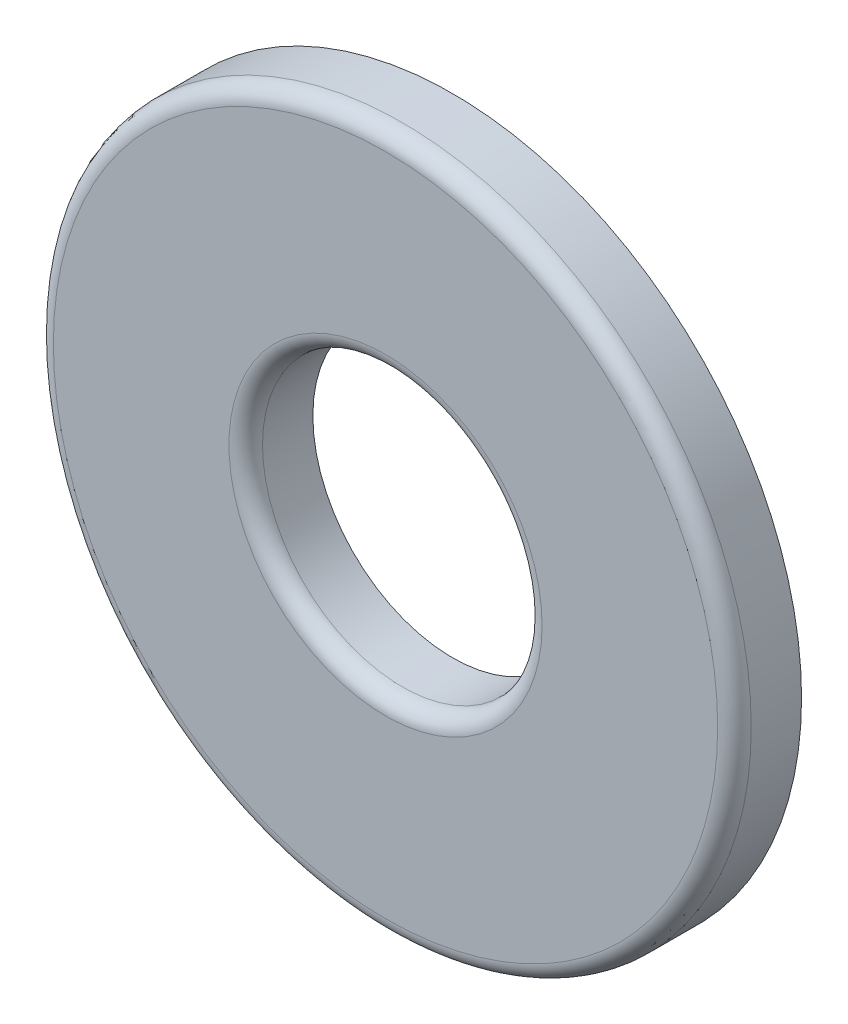
ISO-10303-21;
HEADER;
FILE_DESCRIPTION(('STEP AP214'),'2;1');
FILE_NAME('part.step','',(''),(''),'','','');
FILE_SCHEMA(('AUTOMOTIVE_DESIGN { 1 0 10303 214 1 1 1 1 }'));
ENDSEC;
DATA;
#1=APPLICATION_CONTEXT('core data for automotive mechanical design processes');
#2=APPLICATION_PROTOCOL_DEFINITION('international standard','automotive_design',2000,#1);
#3=PRODUCT_CONTEXT('',#1,'mechanical');
#4=PRODUCT('Part','Part','',(#3));
#5=PRODUCT_RELATED_PRODUCT_CATEGORY('part','',(#4));
#6=PRODUCT_DEFINITION_FORMATION('','',#4);
#7=PRODUCT_DEFINITION_CONTEXT('part definition',#1,'design');
#8=PRODUCT_DEFINITION('design','',#6,#7);
#9=PRODUCT_DEFINITION_SHAPE('','',#8);
#10=(LENGTH_UNIT() NAMED_UNIT(*) SI_UNIT(.MILLI.,.METRE.));
#11=(NAMED_UNIT(*) PLANE_ANGLE_UNIT() SI_UNIT($,.RADIAN.));
#12=(NAMED_UNIT(*) SI_UNIT($,.STERADIAN.) SOLID_ANGLE_UNIT());
#13=UNCERTAINTY_MEASURE_WITH_UNIT(LENGTH_MEASURE(1.E-05),#10,'distance_accuracy_value','');
#14=(GEOMETRIC_REPRESENTATION_CONTEXT(3) GLOBAL_UNCERTAINTY_ASSIGNED_CONTEXT((#13)) GLOBAL_UNIT_ASSIGNED_CONTEXT((#10,
#11,#12)) REPRESENTATION_CONTEXT('',''));
#15=CARTESIAN_POINT('',(0.,0.,0.));
#16=DIRECTION('',(0.,0.,1.));
#17=DIRECTION('',(1.,0.,0.));
#18=AXIS2_PLACEMENT_3D('',#15,#16,#17);
#19=CARTESIAN_POINT('',(0.,0.,0.380999999999997));
#20=DIRECTION('',(0.,0.,1.));
#21=DIRECTION('',(1.,0.,0.));
#22=AXIS2_PLACEMENT_3D('',#19,#20,#21);
#23=PLANE('',#22);
#24=CARTESIAN_POINT('',(0.,0.,0.380999999999997));
#25=DIRECTION('',(0.,0.,1.));
#26=DIRECTION('',(1.,0.,0.));
#27=AXIS2_PLACEMENT_3D('',#24,#25,#26);
#28=CIRCLE('',#27,3.7719);
#29=CARTESIAN_POINT('',(3.7719,0.,0.380999999999997));
#30=VERTEX_POINT('',#29);
#31=EDGE_CURVE('E57',#30,#30,#28,.T.);
#32=ORIENTED_EDGE('',*,*,#31,.T.);
#33=EDGE_LOOP('',(#32));
#34=FACE_BOUND('',#33,.T.);
#35=CARTESIAN_POINT('',(0.,0.,0.380999999999997));
#36=DIRECTION('',(0.,0.,1.));
#37=DIRECTION('',(1.,0.,0.));
#38=AXIS2_PLACEMENT_3D('',#35,#36,#37);
#39=CIRCLE('',#38,1.778);
#40=CARTESIAN_POINT('',(1.778,0.,0.380999999999997));
#41=VERTEX_POINT('',#40);
#42=EDGE_CURVE('E63',#41,#41,#39,.F.);
#43=ORIENTED_EDGE('',*,*,#42,.T.);
#44=EDGE_LOOP('',(#43));
#45=FACE_BOUND('',#44,.T.);
#46=ADVANCED_FACE('F43',(#34,#45),#23,.T.);
#47=CARTESIAN_POINT('',(0.,0.,0.380999999999997));
#48=DIRECTION('',(0.,0.,-1.));
#49=DIRECTION('',(-1.,0.,0.));
#50=AXIS2_PLACEMENT_3D('',#47,#48,#49);
#51=CYLINDRICAL_SURFACE('',#50,3.9624);
#52=CARTESIAN_POINT('',(0.,0.,0.190499999999997));
#53=DIRECTION('',(0.,0.,1.));
#54=DIRECTION('',(1.,0.,0.));
#55=AXIS2_PLACEMENT_3D('',#52,#53,#54);
#56=CIRCLE('',#55,3.9624);
#57=CARTESIAN_POINT('',(-3.9624,0.,0.190499999999997));
#58=VERTEX_POINT('',#57);
#59=EDGE_CURVE('E51',#58,#58,#56,.F.);
#60=CARTESIAN_POINT('',(0.,0.,-0.381000000000003));
#61=DIRECTION('',(0.,0.,1.));
#62=DIRECTION('',(1.,0.,0.));
#63=AXIS2_PLACEMENT_3D('',#60,#61,#62);
#64=CIRCLE('',#63,3.9624);
#65=CARTESIAN_POINT('',(-3.9624,0.,-0.381000000000003));
#66=VERTEX_POINT('',#65);
#67=EDGE_CURVE('E69',#66,#66,#64,.T.);
#68=CARTESIAN_POINT('',(-3.9624,0.,0.190499999999997));
#69=CARTESIAN_POINT('',(-3.9624,0.,0.184546874999997));
#70=CARTESIAN_POINT('',(-3.9624,0.,0.178593749999997));
#71=CARTESIAN_POINT('',(-3.9624,0.,0.166687499999997));
#72=CARTESIAN_POINT('',(-3.9624,0.,0.160734374999997));
#73=CARTESIAN_POINT('',(-3.9624,0.,0.148828124999997));
#74=CARTESIAN_POINT('',(-3.9624,0.,0.142874999999997));
#75=CARTESIAN_POINT('',(-3.9624,0.,0.130968749999997));
#76=CARTESIAN_POINT('',(-3.9624,0.,0.125015624999997));
#77=CARTESIAN_POINT('',(-3.9624,0.,0.113109374999997));
#78=CARTESIAN_POINT('',(-3.9624,0.,0.107156249999997));
#79=CARTESIAN_POINT('',(-3.9624,0.,0.0952499999999972));
#80=CARTESIAN_POINT('',(-3.9624,0.,0.0892968749999972));
#81=CARTESIAN_POINT('',(-3.9624,0.,0.0773906249999972));
#82=CARTESIAN_POINT('',(-3.9624,0.,0.0714374999999972));
#83=CARTESIAN_POINT('',(-3.9624,0.,0.0595312499999972));
#84=CARTESIAN_POINT('',(-3.9624,0.,0.0535781249999973));
#85=CARTESIAN_POINT('',(-3.9624,0.,0.0416718749999973));
#86=CARTESIAN_POINT('',(-3.9624,0.,0.0357187499999973));
#87=CARTESIAN_POINT('',(-3.9624,0.,0.0238124999999972));
#88=CARTESIAN_POINT('',(-3.9624,0.,0.0178593749999972));
#89=CARTESIAN_POINT('',(-3.9624,0.,0.00595312499999723));
#90=CARTESIAN_POINT('',(-3.9624,0.,0.));
#91=CARTESIAN_POINT('',(-3.9624,0.,-0.0119062500000028));
#92=CARTESIAN_POINT('',(-3.9624,0.,-0.0178593750000028));
#93=CARTESIAN_POINT('',(-3.9624,0.,-0.0297656250000028));
#94=CARTESIAN_POINT('',(-3.9624,0.,-0.0357187500000028));
#95=CARTESIAN_POINT('',(-3.9624,0.,-0.0476250000000028));
#96=CARTESIAN_POINT('',(-3.9624,0.,-0.0535781250000028));
#97=CARTESIAN_POINT('',(-3.9624,0.,-0.0654843750000028));
#98=CARTESIAN_POINT('',(-3.9624,0.,-0.0714375000000028));
#99=CARTESIAN_POINT('',(-3.9624,0.,-0.0833437500000028));
#100=CARTESIAN_POINT('',(-3.9624,0.,-0.0892968750000028));
#101=CARTESIAN_POINT('',(-3.9624,0.,-0.101203125000003));
#102=CARTESIAN_POINT('',(-3.9624,0.,-0.107156250000003));
#103=CARTESIAN_POINT('',(-3.9624,0.,-0.119062500000003));
#104=CARTESIAN_POINT('',(-3.9624,0.,-0.125015625000003));
#105=CARTESIAN_POINT('',(-3.9624,0.,-0.136921875000003));
#106=CARTESIAN_POINT('',(-3.9624,0.,-0.142875000000003));
#107=CARTESIAN_POINT('',(-3.9624,0.,-0.154781250000003));
#108=CARTESIAN_POINT('',(-3.9624,0.,-0.160734375000003));
#109=CARTESIAN_POINT('',(-3.9624,0.,-0.172640625000003));
#110=CARTESIAN_POINT('',(-3.9624,0.,-0.178593750000003));
#111=CARTESIAN_POINT('',(-3.9624,0.,-0.190500000000003));
#112=CARTESIAN_POINT('',(-3.9624,0.,-0.196453125000003));
#113=CARTESIAN_POINT('',(-3.9624,0.,-0.208359375000003));
#114=CARTESIAN_POINT('',(-3.9624,0.,-0.214312500000003));
#115=CARTESIAN_POINT('',(-3.9624,0.,-0.226218750000003));
#116=CARTESIAN_POINT('',(-3.9624,0.,-0.232171875000003));
#117=CARTESIAN_POINT('',(-3.9624,0.,-0.244078125000003));
#118=CARTESIAN_POINT('',(-3.9624,0.,-0.250031250000003));
#119=CARTESIAN_POINT('',(-3.9624,0.,-0.261937500000003));
#120=CARTESIAN_POINT('',(-3.9624,0.,-0.267890625000003));
#121=CARTESIAN_POINT('',(-3.9624,0.,-0.279796875000003));
#122=CARTESIAN_POINT('',(-3.9624,0.,-0.285750000000003));
#123=CARTESIAN_POINT('',(-3.9624,0.,-0.297656250000003));
#124=CARTESIAN_POINT('',(-3.9624,0.,-0.303609375000003));
#125=CARTESIAN_POINT('',(-3.9624,0.,-0.315515625000003));
#126=CARTESIAN_POINT('',(-3.9624,0.,-0.321468750000003));
#127=CARTESIAN_POINT('',(-3.9624,0.,-0.333375000000003));
#128=CARTESIAN_POINT('',(-3.9624,0.,-0.339328125000003));
#129=CARTESIAN_POINT('',(-3.9624,0.,-0.351234375000003));
#130=CARTESIAN_POINT('',(-3.9624,0.,-0.357187500000003));
#131=CARTESIAN_POINT('',(-3.9624,0.,-0.369093750000003));
#132=CARTESIAN_POINT('',(-3.9624,0.,-0.375046875000003));
#133=CARTESIAN_POINT('',(-3.9624,0.,-0.381000000000003));
#134=B_SPLINE_CURVE_WITH_KNOTS('',3,(#68,#69,#70,#71,#72,#73,#74,#75,#76,#77,#78,#79,#80,#81,
#82,#83,#84,#85,#86,#87,#88,#89,#90,#91,#92,#93,#94,#95,#96,#97,#98,#99,#100,#101,#102,#103,
#104,#105,#106,#107,#108,#109,#110,#111,#112,#113,#114,#115,#116,#117,#118,#119,#120,#121,#122,
#123,#124,#125,#126,#127,#128,#129,#130,#131,#132,#133),.UNSPECIFIED.,.F.,.F.,(4,2,2,2,2,2,2,2,
2,2,2,2,2,2,2,2,2,2,2,2,2,2,2,2,2,2,2,2,2,2,2,2,4),(0.,0.017859375,0.03571875,0.053578125,
0.0714375,0.089296875,0.10715625,0.125015625,0.142875,0.160734375,0.17859375,0.196453125,
0.2143125,0.232171875,0.25003125,0.267890625,0.28575,0.303609375,0.32146875,0.339328125,
0.3571875,0.375046875,0.39290625,0.410765625,0.428625,0.446484375,0.46434375,0.482203125,
0.5000625,0.517921875,0.53578125,0.553640625,0.5715),.UNSPECIFIED.);
#135=EDGE_CURVE('BSEAM84',#58,#66,#134,.T.);
#136=ORIENTED_EDGE('',*,*,#59,.T.);
#137=ORIENTED_EDGE('',*,*,#67,.T.);
#138=ORIENTED_EDGE('',*,*,#135,.T.);
#139=ORIENTED_EDGE('',*,*,#135,.F.);
#140=EDGE_LOOP('',(#136,#138,#137,#139));
#141=FACE_BOUND('',#140,.T.);
#142=ADVANCED_FACE('F84',(#141),#51,.T.);
#143=CARTESIAN_POINT('',(0.,0.,0.380999999999997));
#144=DIRECTION('',(0.,0.,-1.));
#145=DIRECTION('',(-1.,0.,0.));
#146=AXIS2_PLACEMENT_3D('',#143,#144,#145);
#147=CYLINDRICAL_SURFACE('',#146,1.5875);
#148=CARTESIAN_POINT('',(0.,0.,0.190499999999997));
#149=DIRECTION('',(0.,0.,1.));
#150=DIRECTION('',(1.,0.,0.));
#151=AXIS2_PLACEMENT_3D('',#148,#149,#150);
#152=CIRCLE('',#151,1.5875);
#153=CARTESIAN_POINT('',(-1.5875,0.,0.190499999999997));
#154=VERTEX_POINT('',#153);
#155=EDGE_CURVE('E10',#154,#154,#152,.T.);
#156=CARTESIAN_POINT('',(0.,0.,-0.381000000000003));
#157=DIRECTION('',(0.,0.,1.));
#158=DIRECTION('',(1.,0.,0.));
#159=AXIS2_PLACEMENT_3D('',#156,#157,#158);
#160=CIRCLE('',#159,1.5875);
#161=CARTESIAN_POINT('',(-1.5875,0.,-0.381000000000003));
#162=VERTEX_POINT('',#161);
#163=EDGE_CURVE('E73',#162,#162,#160,.T.);
#164=CARTESIAN_POINT('',(-1.5875,0.,0.190499999999997));
#165=CARTESIAN_POINT('',(-1.5875,0.,0.184546874999997));
#166=CARTESIAN_POINT('',(-1.5875,0.,0.178593749999997));
#167=CARTESIAN_POINT('',(-1.5875,0.,0.166687499999997));
#168=CARTESIAN_POINT('',(-1.5875,0.,0.160734374999997));
#169=CARTESIAN_POINT('',(-1.5875,0.,0.148828124999997));
#170=CARTESIAN_POINT('',(-1.5875,0.,0.142874999999997));
#171=CARTESIAN_POINT('',(-1.5875,0.,0.130968749999997));
#172=CARTESIAN_POINT('',(-1.5875,0.,0.125015624999997));
#173=CARTESIAN_POINT('',(-1.5875,0.,0.113109374999997));
#174=CARTESIAN_POINT('',(-1.5875,0.,0.107156249999997));
#175=CARTESIAN_POINT('',(-1.5875,0.,0.0952499999999972));
#176=CARTESIAN_POINT('',(-1.5875,0.,0.0892968749999972));
#177=CARTESIAN_POINT('',(-1.5875,0.,0.0773906249999972));
#178=CARTESIAN_POINT('',(-1.5875,0.,0.0714374999999972));
#179=CARTESIAN_POINT('',(-1.5875,0.,0.0595312499999972));
#180=CARTESIAN_POINT('',(-1.5875,0.,0.0535781249999973));
#181=CARTESIAN_POINT('',(-1.5875,0.,0.0416718749999973));
#182=CARTESIAN_POINT('',(-1.5875,0.,0.0357187499999973));
#183=CARTESIAN_POINT('',(-1.5875,0.,0.0238124999999972));
#184=CARTESIAN_POINT('',(-1.5875,0.,0.0178593749999972));
#185=CARTESIAN_POINT('',(-1.5875,0.,0.00595312499999723));
#186=CARTESIAN_POINT('',(-1.5875,0.,0.));
#187=CARTESIAN_POINT('',(-1.5875,0.,-0.0119062500000028));
#188=CARTESIAN_POINT('',(-1.5875,0.,-0.0178593750000028));
#189=CARTESIAN_POINT('',(-1.5875,0.,-0.0297656250000028));
#190=CARTESIAN_POINT('',(-1.5875,0.,-0.0357187500000028));
#191=CARTESIAN_POINT('',(-1.5875,0.,-0.0476250000000028));
#192=CARTESIAN_POINT('',(-1.5875,0.,-0.0535781250000028));
#193=CARTESIAN_POINT('',(-1.5875,0.,-0.0654843750000028));
#194=CARTESIAN_POINT('',(-1.5875,0.,-0.0714375000000028));
#195=CARTESIAN_POINT('',(-1.5875,0.,-0.0833437500000028));
#196=CARTESIAN_POINT('',(-1.5875,0.,-0.0892968750000028));
#197=CARTESIAN_POINT('',(-1.5875,0.,-0.101203125000003));
#198=CARTESIAN_POINT('',(-1.5875,0.,-0.107156250000003));
#199=CARTESIAN_POINT('',(-1.5875,0.,-0.119062500000003));
#200=CARTESIAN_POINT('',(-1.5875,0.,-0.125015625000003));
#201=CARTESIAN_POINT('',(-1.5875,0.,-0.136921875000003));
#202=CARTESIAN_POINT('',(-1.5875,0.,-0.142875000000003));
#203=CARTESIAN_POINT('',(-1.5875,0.,-0.154781250000003));
#204=CARTESIAN_POINT('',(-1.5875,0.,-0.160734375000003));
#205=CARTESIAN_POINT('',(-1.5875,0.,-0.172640625000003));
#206=CARTESIAN_POINT('',(-1.5875,0.,-0.178593750000003));
#207=CARTESIAN_POINT('',(-1.5875,0.,-0.190500000000003));
#208=CARTESIAN_POINT('',(-1.5875,0.,-0.196453125000003));
#209=CARTESIAN_POINT('',(-1.5875,0.,-0.208359375000003));
#210=CARTESIAN_POINT('',(-1.5875,0.,-0.214312500000003));
#211=CARTESIAN_POINT('',(-1.5875,0.,-0.226218750000003));
#212=CARTESIAN_POINT('',(-1.5875,0.,-0.232171875000003));
#213=CARTESIAN_POINT('',(-1.5875,0.,-0.244078125000003));
#214=CARTESIAN_POINT('',(-1.5875,0.,-0.250031250000003));
#215=CARTESIAN_POINT('',(-1.5875,0.,-0.261937500000003));
#216=CARTESIAN_POINT('',(-1.5875,0.,-0.267890625000003));
#217=CARTESIAN_POINT('',(-1.5875,0.,-0.279796875000003));
#218=CARTESIAN_POINT('',(-1.5875,0.,-0.285750000000003));
#219=CARTESIAN_POINT('',(-1.5875,0.,-0.297656250000003));
#220=CARTESIAN_POINT('',(-1.5875,0.,-0.303609375000003));
#221=CARTESIAN_POINT('',(-1.5875,0.,-0.315515625000003));
#222=CARTESIAN_POINT('',(-1.5875,0.,-0.321468750000003));
#223=CARTESIAN_POINT('',(-1.5875,0.,-0.333375000000003));
#224=CARTESIAN_POINT('',(-1.5875,0.,-0.339328125000003));
#225=CARTESIAN_POINT('',(-1.5875,0.,-0.351234375000003));
#226=CARTESIAN_POINT('',(-1.5875,0.,-0.357187500000003));
#227=CARTESIAN_POINT('',(-1.5875,0.,-0.369093750000003));
#228=CARTESIAN_POINT('',(-1.5875,0.,-0.375046875000003));
#229=CARTESIAN_POINT('',(-1.5875,0.,-0.381000000000003));
#230=B_SPLINE_CURVE_WITH_KNOTS('',3,(#164,#165,#166,#167,#168,#169,#170,#171,#172,#173,#174,
#175,#176,#177,#178,#179,#180,#181,#182,#183,#184,#185,#186,#187,#188,#189,#190,#191,#192,#193,
#194,#195,#196,#197,#198,#199,#200,#201,#202,#203,#204,#205,#206,#207,#208,#209,#210,#211,#212,
#213,#214,#215,#216,#217,#218,#219,#220,#221,#222,#223,#224,#225,#226,#227,#228,#229),
.UNSPECIFIED.,.F.,.F.,(4,2,2,2,2,2,2,2,2,2,2,2,2,2,2,2,2,2,2,2,2,2,2,2,2,2,2,2,2,2,2,2,4),(0.,
0.017859375,0.03571875,0.053578125,0.0714375,0.089296875,0.10715625,0.125015625,0.142875,
0.160734375,0.17859375,0.196453125,0.2143125,0.232171875,0.25003125,0.267890625,0.28575,
0.303609375,0.32146875,0.339328125,0.3571875,0.375046875,0.39290625,0.410765625,0.428625,
0.446484375,0.46434375,0.482203125,0.5000625,0.517921875,0.53578125,0.553640625,0.5715),.UNSPECIFIED.);
#231=EDGE_CURVE('BSEAM82',#154,#162,#230,.T.);
#232=ORIENTED_EDGE('',*,*,#155,.T.);
#233=ORIENTED_EDGE('',*,*,#163,.F.);
#234=ORIENTED_EDGE('',*,*,#231,.T.);
#235=ORIENTED_EDGE('',*,*,#231,.F.);
#236=EDGE_LOOP('',(#232,#234,#233,#235));
#237=FACE_BOUND('',#236,.T.);
#238=ADVANCED_FACE('F82',(#237),#147,.F.);
#239=CARTESIAN_POINT('',(0.,0.,-0.381000000000003));
#240=DIRECTION('',(0.,0.,1.));
#241=DIRECTION('',(1.,0.,0.));
#242=AXIS2_PLACEMENT_3D('',#239,#240,#241);
#243=PLANE('',#242);
#244=ORIENTED_EDGE('',*,*,#163,.T.);
#245=EDGE_LOOP('',(#244));
#246=FACE_BOUND('',#245,.T.);
#247=ORIENTED_EDGE('',*,*,#67,.F.);
#248=EDGE_LOOP('',(#247));
#249=FACE_BOUND('',#248,.T.);
#250=ADVANCED_FACE('F79',(#246,#249),#243,.F.);
#251=CARTESIAN_POINT('',(0.,0.,0.190499999999997));
#252=DIRECTION('',(0.,0.,1.));
#253=DIRECTION('',(1.,0.,0.));
#254=AXIS2_PLACEMENT_3D('',#251,#252,#253);
#255=TOROIDAL_SURFACE('',#254,3.7719,0.1905);
#256=ORIENTED_EDGE('',*,*,#59,.F.);
#257=EDGE_LOOP('',(#256));
#258=FACE_BOUND('',#257,.T.);
#259=ORIENTED_EDGE('',*,*,#31,.F.);
#260=EDGE_LOOP('',(#259));
#261=FACE_BOUND('',#260,.T.);
#262=ADVANCED_FACE('F91',(#258,#261),#255,.T.);
#263=CARTESIAN_POINT('',(0.,0.,0.190499999999997));
#264=DIRECTION('',(0.,0.,1.));
#265=DIRECTION('',(1.,0.,0.));
#266=AXIS2_PLACEMENT_3D('',#263,#264,#265);
#267=TOROIDAL_SURFACE('',#266,1.778,0.1905);
#268=ORIENTED_EDGE('',*,*,#42,.F.);
#269=EDGE_LOOP('',(#268));
#270=FACE_BOUND('',#269,.T.);
#271=ORIENTED_EDGE('',*,*,#155,.F.);
#272=EDGE_LOOP('',(#271));
#273=FACE_BOUND('',#272,.T.);
#274=ADVANCED_FACE('F45',(#270,#273),#267,.T.);
#275=CLOSED_SHELL('',(#46,#142,#238,#250,#262,#274));
#276=MANIFOLD_SOLID_BREP('B2',#275);
#277=ADVANCED_BREP_SHAPE_REPRESENTATION('',(#18,#276),#14);
#278=SHAPE_DEFINITION_REPRESENTATION(#9,#277);
ENDSEC;
END-ISO-10303-21;
